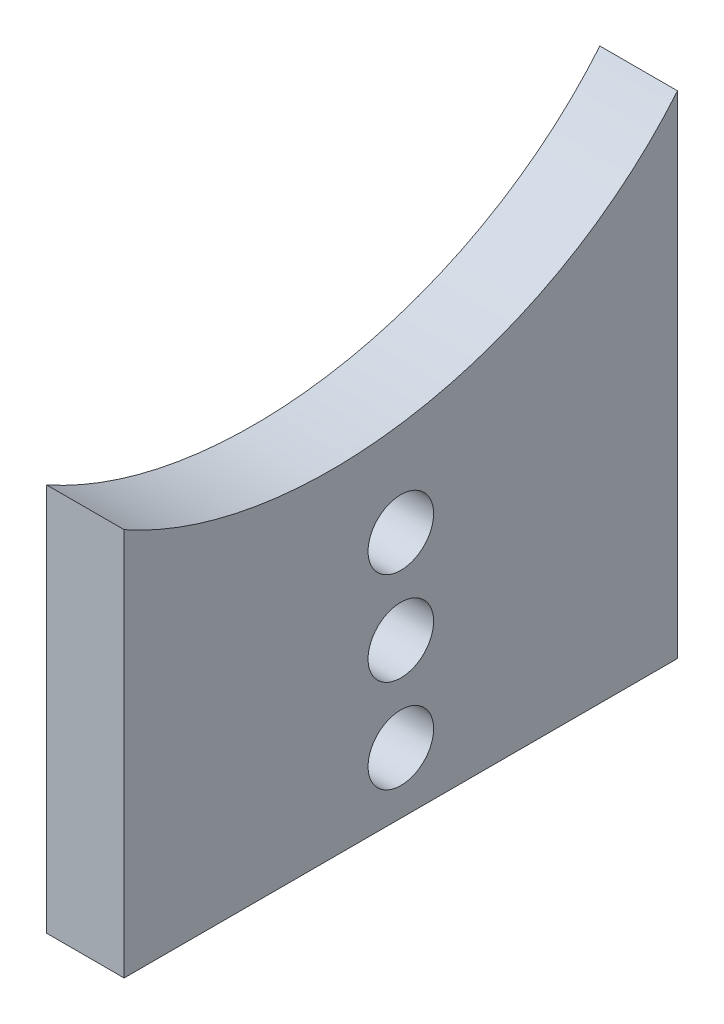
ISO-10303-21;
HEADER;
FILE_DESCRIPTION(('STEP AP214'),'2;1');
FILE_NAME('part.step','',(''),(''),'','','');
FILE_SCHEMA(('AUTOMOTIVE_DESIGN { 1 0 10303 214 1 1 1 1 }'));
ENDSEC;
DATA;
#1=APPLICATION_CONTEXT('core data for automotive mechanical design processes');
#2=APPLICATION_PROTOCOL_DEFINITION('international standard','automotive_design',2000,#1);
#3=PRODUCT_CONTEXT('',#1,'mechanical');
#4=PRODUCT('Part','Part','',(#3));
#5=PRODUCT_RELATED_PRODUCT_CATEGORY('part','',(#4));
#6=PRODUCT_DEFINITION_FORMATION('','',#4);
#7=PRODUCT_DEFINITION_CONTEXT('part definition',#1,'design');
#8=PRODUCT_DEFINITION('design','',#6,#7);
#9=PRODUCT_DEFINITION_SHAPE('','',#8);
#10=(LENGTH_UNIT() NAMED_UNIT(*) SI_UNIT(.MILLI.,.METRE.));
#11=(NAMED_UNIT(*) PLANE_ANGLE_UNIT() SI_UNIT($,.RADIAN.));
#12=(NAMED_UNIT(*) SI_UNIT($,.STERADIAN.) SOLID_ANGLE_UNIT());
#13=UNCERTAINTY_MEASURE_WITH_UNIT(LENGTH_MEASURE(1.E-05),#10,'distance_accuracy_value','');
#14=(GEOMETRIC_REPRESENTATION_CONTEXT(3) GLOBAL_UNCERTAINTY_ASSIGNED_CONTEXT((#13)) GLOBAL_UNIT_ASSIGNED_CONTEXT((#10,
#11,#12)) REPRESENTATION_CONTEXT('',''));
#15=CARTESIAN_POINT('',(0.,0.,0.));
#16=DIRECTION('',(0.,0.,1.));
#17=DIRECTION('',(1.,0.,0.));
#18=AXIS2_PLACEMENT_3D('',#15,#16,#17);
#19=CARTESIAN_POINT('',(10.,-5.82903482245928,-8.74260937903472));
#20=DIRECTION('',(-1.,0.,0.));
#21=DIRECTION('',(0.,0.,1.));
#22=AXIS2_PLACEMENT_3D('',#19,#20,#21);
#23=PLANE('',#22);
#24=CARTESIAN_POINT('',(10.,13.142555632199,-42.2104361717679));
#25=CARTESIAN_POINT('',(10.,-7.0949628561079,-25.4276721339547));
#26=CARTESIAN_POINT('',(10.,-12.774809736908,6.49999270373169));
#27=CARTESIAN_POINT('',(10.,-0.165516432825419,29.0525994301592));
#28=B_SPLINE_CURVE_WITH_KNOTS('',3,(#24,#25,#26,#27),.UNSPECIFIED.,.F.,.F.,(4,4),(0.,1.),.UNSPECIFIED.);
#29=CARTESIAN_POINT('',(10.,13.142555632199,-42.2104361717679));
#30=VERTEX_POINT('',#29);
#31=CARTESIAN_POINT('',(10.,-0.165516432825417,29.0525994301592));
#32=VERTEX_POINT('',#31);
#33=EDGE_CURVE('E92',#30,#32,#28,.T.);
#34=ORIENTED_EDGE('',*,*,#33,.T.);
#35=DIRECTION('',(0.,-1.,0.));
#36=VECTOR('',#35,1.);
#37=CARTESIAN_POINT('',(10.,-0.165516432825417,29.0525994301592));
#38=LINE('',#37,#36);
#39=CARTESIAN_POINT('',(10.,-50.1655164328254,29.0525994301592));
#40=VERTEX_POINT('',#39);
#41=EDGE_CURVE('E87',#32,#40,#38,.T.);
#42=ORIENTED_EDGE('',*,*,#41,.T.);
#43=DIRECTION('',(0.,0.,-1.));
#44=VECTOR('',#43,1.);
#45=CARTESIAN_POINT('',(10.,-50.1655164328254,-42.2104361717679));
#46=LINE('',#45,#44);
#47=CARTESIAN_POINT('',(10.,-50.1655164328254,-42.2104361717679));
#48=VERTEX_POINT('',#47);
#49=EDGE_CURVE('E90',#40,#48,#46,.T.);
#50=ORIENTED_EDGE('',*,*,#49,.T.);
#51=DIRECTION('',(0.,1.,0.));
#52=VECTOR('',#51,1.);
#53=CARTESIAN_POINT('',(10.,13.142555632199,-42.2104361717679));
#54=LINE('',#53,#52);
#55=EDGE_CURVE('E57',#48,#30,#54,.T.);
#56=ORIENTED_EDGE('',*,*,#55,.T.);
#57=EDGE_LOOP('',(#34,#42,#50,#56));
#58=FACE_BOUND('',#57,.T.);
#59=CARTESIAN_POINT('',(10.,-42.297054629816,-6.57891837080433));
#60=DIRECTION('',(1.,0.,0.));
#61=DIRECTION('',(0.,0.,-1.));
#62=AXIS2_PLACEMENT_3D('',#59,#60,#61);
#63=CIRCLE('',#62,4.22183790583322);
#64=CARTESIAN_POINT('',(10.,-42.297054629816,-10.8007562766376));
#65=VERTEX_POINT('',#64);
#66=EDGE_CURVE('E108',#65,#65,#63,.T.);
#67=ORIENTED_EDGE('',*,*,#66,.F.);
#68=EDGE_LOOP('',(#67));
#69=FACE_BOUND('',#68,.T.);
#70=CARTESIAN_POINT('',(10.,-30.297054629816,-6.57891837080433));
#71=DIRECTION('',(1.,0.,0.));
#72=DIRECTION('',(0.,0.,-1.));
#73=AXIS2_PLACEMENT_3D('',#70,#71,#72);
#74=CIRCLE('',#73,4.22183790583322);
#75=CARTESIAN_POINT('',(10.,-30.297054629816,-10.8007562766376));
#76=VERTEX_POINT('',#75);
#77=EDGE_CURVE('E132',#76,#76,#74,.T.);
#78=ORIENTED_EDGE('',*,*,#77,.F.);
#79=EDGE_LOOP('',(#78));
#80=FACE_BOUND('',#79,.T.);
#81=CARTESIAN_POINT('',(10.,-18.297054629816,-6.57891837080433));
#82=DIRECTION('',(1.,0.,0.));
#83=DIRECTION('',(0.,0.,-1.));
#84=AXIS2_PLACEMENT_3D('',#81,#82,#83);
#85=CIRCLE('',#84,4.22183790583322);
#86=CARTESIAN_POINT('',(10.,-18.297054629816,-10.8007562766376));
#87=VERTEX_POINT('',#86);
#88=EDGE_CURVE('E138',#87,#87,#85,.T.);
#89=ORIENTED_EDGE('',*,*,#88,.F.);
#90=EDGE_LOOP('',(#89));
#91=FACE_BOUND('',#90,.T.);
#92=ADVANCED_FACE('F39',(#58,#69,#80,#91),#23,.F.);
#93=CARTESIAN_POINT('',(0.,-5.82903482245928,-8.74260937903472));
#94=DIRECTION('',(-1.,0.,0.));
#95=DIRECTION('',(0.,0.,1.));
#96=AXIS2_PLACEMENT_3D('',#93,#94,#95);
#97=PLANE('',#96);
#98=CARTESIAN_POINT('',(0.,-30.297054629816,-6.57891837080433));
#99=DIRECTION('',(1.,0.,0.));
#100=DIRECTION('',(0.,0.,-1.));
#101=AXIS2_PLACEMENT_3D('',#98,#99,#100);
#102=CIRCLE('',#101,4.22183790583322);
#103=CARTESIAN_POINT('',(0.,-30.297054629816,-10.8007562766376));
#104=VERTEX_POINT('',#103);
#105=EDGE_CURVE('E135',#104,#104,#102,.T.);
#106=ORIENTED_EDGE('',*,*,#105,.T.);
#107=EDGE_LOOP('',(#106));
#108=FACE_BOUND('',#107,.T.);
#109=CARTESIAN_POINT('',(0.,13.142555632199,-42.2104361717679));
#110=CARTESIAN_POINT('',(0.,-7.0949628561079,-25.4276721339547));
#111=CARTESIAN_POINT('',(0.,-12.774809736908,6.49999270373169));
#112=CARTESIAN_POINT('',(0.,-0.165516432825419,29.0525994301592));
#113=B_SPLINE_CURVE_WITH_KNOTS('',3,(#109,#110,#111,#112),.UNSPECIFIED.,.F.,.F.,(4,4),(0.,1.),.UNSPECIFIED.);
#114=CARTESIAN_POINT('',(0.,13.142555632199,-42.2104361717679));
#115=VERTEX_POINT('',#114);
#116=CARTESIAN_POINT('',(0.,-0.165516432825417,29.0525994301592));
#117=VERTEX_POINT('',#116);
#118=EDGE_CURVE('E103',#115,#117,#113,.T.);
#119=ORIENTED_EDGE('',*,*,#118,.F.);
#120=DIRECTION('',(0.,1.,0.));
#121=VECTOR('',#120,1.);
#122=CARTESIAN_POINT('',(0.,13.142555632199,-42.2104361717679));
#123=LINE('',#122,#121);
#124=CARTESIAN_POINT('',(0.,-50.1655164328254,-42.2104361717679));
#125=VERTEX_POINT('',#124);
#126=EDGE_CURVE('E80',#125,#115,#123,.T.);
#127=ORIENTED_EDGE('',*,*,#126,.F.);
#128=DIRECTION('',(0.,0.,-1.));
#129=VECTOR('',#128,1.);
#130=CARTESIAN_POINT('',(0.,-50.1655164328254,-42.2104361717679));
#131=LINE('',#130,#129);
#132=CARTESIAN_POINT('',(0.,-50.1655164328254,29.0525994301592));
#133=VERTEX_POINT('',#132);
#134=EDGE_CURVE('E74',#133,#125,#131,.T.);
#135=ORIENTED_EDGE('',*,*,#134,.F.);
#136=DIRECTION('',(0.,-1.,0.));
#137=VECTOR('',#136,1.);
#138=CARTESIAN_POINT('',(0.,-0.165516432825417,29.0525994301592));
#139=LINE('',#138,#137);
#140=EDGE_CURVE('E96',#117,#133,#139,.T.);
#141=ORIENTED_EDGE('',*,*,#140,.F.);
#142=EDGE_LOOP('',(#119,#127,#135,#141));
#143=FACE_BOUND('',#142,.T.);
#144=CARTESIAN_POINT('',(0.,-42.297054629816,-6.57891837080433));
#145=DIRECTION('',(1.,0.,0.));
#146=DIRECTION('',(0.,0.,-1.));
#147=AXIS2_PLACEMENT_3D('',#144,#145,#146);
#148=CIRCLE('',#147,4.22183790583322);
#149=CARTESIAN_POINT('',(0.,-42.297054629816,-10.8007562766376));
#150=VERTEX_POINT('',#149);
#151=EDGE_CURVE('E126',#150,#150,#148,.T.);
#152=ORIENTED_EDGE('',*,*,#151,.T.);
#153=EDGE_LOOP('',(#152));
#154=FACE_BOUND('',#153,.T.);
#155=CARTESIAN_POINT('',(0.,-18.297054629816,-6.57891837080433));
#156=DIRECTION('',(1.,0.,0.));
#157=DIRECTION('',(0.,0.,-1.));
#158=AXIS2_PLACEMENT_3D('',#155,#156,#157);
#159=CIRCLE('',#158,4.22183790583322);
#160=CARTESIAN_POINT('',(0.,-18.297054629816,-10.8007562766376));
#161=VERTEX_POINT('',#160);
#162=EDGE_CURVE('E141',#161,#161,#159,.T.);
#163=ORIENTED_EDGE('',*,*,#162,.T.);
#164=EDGE_LOOP('',(#163));
#165=FACE_BOUND('',#164,.T.);
#166=ADVANCED_FACE('F119',(#108,#143,#154,#165),#97,.T.);
#167=DIRECTION('',(-1.,0.,0.));
#168=VECTOR('',#167,1.);
#169=SURFACE_OF_LINEAR_EXTRUSION('',#28,#168);
#170=ORIENTED_EDGE('',*,*,#118,.T.);
#171=DIRECTION('',(-1.,0.,0.));
#172=VECTOR('',#171,1.);
#173=CARTESIAN_POINT('',(10.,-0.165516432825417,29.0525994301592));
#174=LINE('',#173,#172);
#175=EDGE_CURVE('E11',#32,#117,#174,.T.);
#176=ORIENTED_EDGE('',*,*,#175,.F.);
#177=ORIENTED_EDGE('',*,*,#33,.F.);
#178=DIRECTION('',(-1.,0.,0.));
#179=VECTOR('',#178,1.);
#180=CARTESIAN_POINT('',(10.,13.142555632199,-42.2104361717679));
#181=LINE('',#180,#179);
#182=EDGE_CURVE('E100',#30,#115,#181,.T.);
#183=ORIENTED_EDGE('',*,*,#182,.T.);
#184=EDGE_LOOP('',(#170,#176,#177,#183));
#185=FACE_BOUND('',#184,.T.);
#186=ADVANCED_FACE('F41',(#185),#169,.F.);
#187=CARTESIAN_POINT('',(10.,-0.165516432825417,29.0525994301592));
#188=DIRECTION('',(0.,0.,-1.));
#189=DIRECTION('',(-1.,0.,0.));
#190=AXIS2_PLACEMENT_3D('',#187,#188,#189);
#191=PLANE('',#190);
#192=ORIENTED_EDGE('',*,*,#140,.T.);
#193=DIRECTION('',(-1.,0.,0.));
#194=VECTOR('',#193,1.);
#195=CARTESIAN_POINT('',(10.,-50.1655164328254,29.0525994301592));
#196=LINE('',#195,#194);
#197=EDGE_CURVE('E49',#40,#133,#196,.T.);
#198=ORIENTED_EDGE('',*,*,#197,.F.);
#199=ORIENTED_EDGE('',*,*,#41,.F.);
#200=ORIENTED_EDGE('',*,*,#175,.T.);
#201=EDGE_LOOP('',(#192,#198,#199,#200));
#202=FACE_BOUND('',#201,.T.);
#203=ADVANCED_FACE('F95',(#202),#191,.F.);
#204=CARTESIAN_POINT('',(10.,-50.1655164328254,-42.2104361717679));
#205=DIRECTION('',(0.,1.,0.));
#206=DIRECTION('',(0.,0.,1.));
#207=AXIS2_PLACEMENT_3D('',#204,#205,#206);
#208=PLANE('',#207);
#209=ORIENTED_EDGE('',*,*,#134,.T.);
#210=DIRECTION('',(-1.,0.,0.));
#211=VECTOR('',#210,1.);
#212=CARTESIAN_POINT('',(10.,-50.1655164328254,-42.2104361717679));
#213=LINE('',#212,#211);
#214=EDGE_CURVE('E97',#48,#125,#213,.T.);
#215=ORIENTED_EDGE('',*,*,#214,.F.);
#216=ORIENTED_EDGE('',*,*,#49,.F.);
#217=ORIENTED_EDGE('',*,*,#197,.T.);
#218=EDGE_LOOP('',(#209,#215,#216,#217));
#219=FACE_BOUND('',#218,.T.);
#220=ADVANCED_FACE('F98',(#219),#208,.F.);
#221=CARTESIAN_POINT('',(10.,13.142555632199,-42.2104361717679));
#222=DIRECTION('',(0.,0.,1.));
#223=DIRECTION('',(1.,0.,0.));
#224=AXIS2_PLACEMENT_3D('',#221,#222,#223);
#225=PLANE('',#224);
#226=ORIENTED_EDGE('',*,*,#126,.T.);
#227=ORIENTED_EDGE('',*,*,#182,.F.);
#228=ORIENTED_EDGE('',*,*,#55,.F.);
#229=ORIENTED_EDGE('',*,*,#214,.T.);
#230=EDGE_LOOP('',(#226,#227,#228,#229));
#231=FACE_BOUND('',#230,.T.);
#232=ADVANCED_FACE('F116',(#231),#225,.F.);
#233=CARTESIAN_POINT('',(10.,-42.297054629816,-6.57891837080433));
#234=DIRECTION('',(-1.,0.,0.));
#235=DIRECTION('',(0.,0.,1.));
#236=AXIS2_PLACEMENT_3D('',#233,#234,#235);
#237=CYLINDRICAL_SURFACE('',#236,4.22183790583322);
#238=ORIENTED_EDGE('',*,*,#66,.T.);
#239=EDGE_LOOP('',(#238));
#240=FACE_BOUND('',#239,.T.);
#241=ORIENTED_EDGE('',*,*,#151,.F.);
#242=EDGE_LOOP('',(#241));
#243=FACE_BOUND('',#242,.T.);
#244=ADVANCED_FACE('F158',(#240,#243),#237,.F.);
#245=CARTESIAN_POINT('',(10.,-30.297054629816,-6.57891837080433));
#246=DIRECTION('',(-1.,0.,0.));
#247=DIRECTION('',(0.,0.,1.));
#248=AXIS2_PLACEMENT_3D('',#245,#246,#247);
#249=CYLINDRICAL_SURFACE('',#248,4.22183790583322);
#250=ORIENTED_EDGE('',*,*,#77,.T.);
#251=EDGE_LOOP('',(#250));
#252=FACE_BOUND('',#251,.T.);
#253=ORIENTED_EDGE('',*,*,#105,.F.);
#254=EDGE_LOOP('',(#253));
#255=FACE_BOUND('',#254,.T.);
#256=ADVANCED_FACE('F203',(#252,#255),#249,.F.);
#257=CARTESIAN_POINT('',(10.,-18.297054629816,-6.57891837080433));
#258=DIRECTION('',(-1.,0.,0.));
#259=DIRECTION('',(0.,0.,1.));
#260=AXIS2_PLACEMENT_3D('',#257,#258,#259);
#261=CYLINDRICAL_SURFACE('',#260,4.22183790583322);
#262=ORIENTED_EDGE('',*,*,#88,.T.);
#263=EDGE_LOOP('',(#262));
#264=FACE_BOUND('',#263,.T.);
#265=ORIENTED_EDGE('',*,*,#162,.F.);
#266=EDGE_LOOP('',(#265));
#267=FACE_BOUND('',#266,.T.);
#268=ADVANCED_FACE('F147',(#264,#267),#261,.F.);
#269=CLOSED_SHELL('',(#92,#166,#186,#203,#220,#232,#244,#256,#268));
#270=MANIFOLD_SOLID_BREP('B2',#269);
#271=ADVANCED_BREP_SHAPE_REPRESENTATION('',(#18,#270),#14);
#272=SHAPE_DEFINITION_REPRESENTATION(#9,#271);
ENDSEC;
END-ISO-10303-21;
